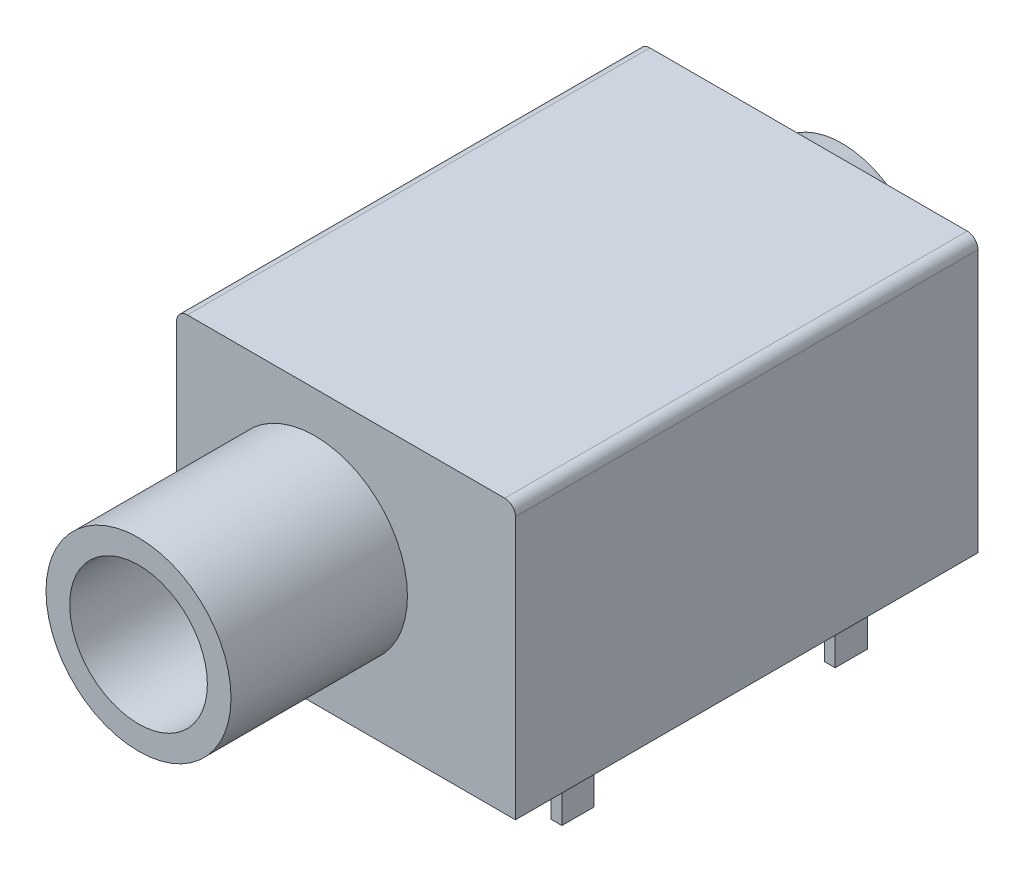
ISO-10303-21;
HEADER;
FILE_DESCRIPTION(('STEP AP214'),'2;1');
FILE_NAME('part.step','',(''),(''),'','','');
FILE_SCHEMA(('AUTOMOTIVE_DESIGN { 1 0 10303 214 1 1 1 1 }'));
ENDSEC;
DATA;
#1=APPLICATION_CONTEXT('core data for automotive mechanical design processes');
#2=APPLICATION_PROTOCOL_DEFINITION('international standard','automotive_design',2000,#1);
#3=PRODUCT_CONTEXT('',#1,'mechanical');
#4=PRODUCT('Part','Part','',(#3));
#5=PRODUCT_RELATED_PRODUCT_CATEGORY('part','',(#4));
#6=PRODUCT_DEFINITION_FORMATION('','',#4);
#7=PRODUCT_DEFINITION_CONTEXT('part definition',#1,'design');
#8=PRODUCT_DEFINITION('design','',#6,#7);
#9=PRODUCT_DEFINITION_SHAPE('','',#8);
#10=(LENGTH_UNIT() NAMED_UNIT(*) SI_UNIT(.MILLI.,.METRE.));
#11=(NAMED_UNIT(*) PLANE_ANGLE_UNIT() SI_UNIT($,.RADIAN.));
#12=(NAMED_UNIT(*) SI_UNIT($,.STERADIAN.) SOLID_ANGLE_UNIT());
#13=UNCERTAINTY_MEASURE_WITH_UNIT(LENGTH_MEASURE(1.E-05),#10,'distance_accuracy_value','');
#14=(GEOMETRIC_REPRESENTATION_CONTEXT(3) GLOBAL_UNCERTAINTY_ASSIGNED_CONTEXT((#13)) GLOBAL_UNIT_ASSIGNED_CONTEXT((#10,
#11,#12)) REPRESENTATION_CONTEXT('',''));
#15=CARTESIAN_POINT('',(0.,0.,0.));
#16=DIRECTION('',(0.,0.,1.));
#17=DIRECTION('',(1.,0.,0.));
#18=AXIS2_PLACEMENT_3D('',#15,#16,#17);
#19=CARTESIAN_POINT('',(0.,0.,-21.5));
#20=DIRECTION('',(0.,-1.,0.));
#21=DIRECTION('',(0.,0.,-1.));
#22=AXIS2_PLACEMENT_3D('',#19,#20,#21);
#23=PLANE('',#22);
#24=DIRECTION('',(1.,0.,0.));
#25=VECTOR('',#24,1.);
#26=CARTESIAN_POINT('',(0.,0.,0.));
#27=LINE('',#26,#25);
#28=CARTESIAN_POINT('',(0.,0.,0.));
#29=VERTEX_POINT('',#28);
#30=CARTESIAN_POINT('',(15.75,0.,0.));
#31=VERTEX_POINT('',#30);
#32=EDGE_CURVE('E393',#29,#31,#27,.T.);
#33=ORIENTED_EDGE('',*,*,#32,.F.);
#34=DIRECTION('',(0.,0.,1.));
#35=VECTOR('',#34,1.);
#36=CARTESIAN_POINT('',(0.,0.,-21.5));
#37=LINE('',#36,#35);
#38=CARTESIAN_POINT('',(0.,0.,-21.5));
#39=VERTEX_POINT('',#38);
#40=EDGE_CURVE('E41',#39,#29,#37,.T.);
#41=ORIENTED_EDGE('',*,*,#40,.F.);
#42=DIRECTION('',(1.,0.,0.));
#43=VECTOR('',#42,1.);
#44=CARTESIAN_POINT('',(0.,0.,-21.5));
#45=LINE('',#44,#43);
#46=CARTESIAN_POINT('',(15.75,0.,-21.5));
#47=VERTEX_POINT('',#46);
#48=EDGE_CURVE('E369',#39,#47,#45,.T.);
#49=ORIENTED_EDGE('',*,*,#48,.T.);
#50=DIRECTION('',(0.,0.,1.));
#51=VECTOR('',#50,1.);
#52=CARTESIAN_POINT('',(15.75,0.,-21.5));
#53=LINE('',#52,#51);
#54=EDGE_CURVE('E422',#47,#31,#53,.T.);
#55=ORIENTED_EDGE('',*,*,#54,.T.);
#56=EDGE_LOOP('',(#33,#41,#49,#55));
#57=FACE_BOUND('',#56,.T.);
#58=DIRECTION('',(-1.,0.,0.));
#59=VECTOR('',#58,1.);
#60=CARTESIAN_POINT('',(1.98,0.,-4.));
#61=LINE('',#60,#59);
#62=CARTESIAN_POINT('',(2.48,0.,-4.));
#63=VERTEX_POINT('',#62);
#64=CARTESIAN_POINT('',(1.98,0.,-4.));
#65=VERTEX_POINT('',#64);
#66=EDGE_CURVE('E322',#63,#65,#61,.T.);
#67=ORIENTED_EDGE('',*,*,#66,.F.);
#68=DIRECTION('',(0.,0.,1.));
#69=VECTOR('',#68,1.);
#70=CARTESIAN_POINT('',(2.48,0.,-4.));
#71=LINE('',#70,#69);
#72=CARTESIAN_POINT('',(2.48,0.,-5.5));
#73=VERTEX_POINT('',#72);
#74=EDGE_CURVE('E304',#73,#63,#71,.T.);
#75=ORIENTED_EDGE('',*,*,#74,.F.);
#76=DIRECTION('',(1.,0.,0.));
#77=VECTOR('',#76,1.);
#78=CARTESIAN_POINT('',(1.98,0.,-5.5));
#79=LINE('',#78,#77);
#80=CARTESIAN_POINT('',(1.98,0.,-5.5));
#81=VERTEX_POINT('',#80);
#82=EDGE_CURVE('E310',#81,#73,#79,.T.);
#83=ORIENTED_EDGE('',*,*,#82,.F.);
#84=DIRECTION('',(0.,0.,-1.));
#85=VECTOR('',#84,1.);
#86=CARTESIAN_POINT('',(1.98,0.,-4.));
#87=LINE('',#86,#85);
#88=EDGE_CURVE('E325',#65,#81,#87,.T.);
#89=ORIENTED_EDGE('',*,*,#88,.F.);
#90=EDGE_LOOP('',(#67,#75,#83,#89));
#91=FACE_BOUND('',#90,.T.);
#92=DIRECTION('',(-1.,0.,0.));
#93=VECTOR('',#92,1.);
#94=CARTESIAN_POINT('',(13.41,0.,-4.));
#95=LINE('',#94,#93);
#96=CARTESIAN_POINT('',(13.91,0.,-4.));
#97=VERTEX_POINT('',#96);
#98=CARTESIAN_POINT('',(13.41,0.,-4.));
#99=VERTEX_POINT('',#98);
#100=EDGE_CURVE('E282',#97,#99,#95,.T.);
#101=ORIENTED_EDGE('',*,*,#100,.F.);
#102=DIRECTION('',(0.,0.,1.));
#103=VECTOR('',#102,1.);
#104=CARTESIAN_POINT('',(13.91,0.,-5.5));
#105=LINE('',#104,#103);
#106=CARTESIAN_POINT('',(13.91,0.,-5.5));
#107=VERTEX_POINT('',#106);
#108=EDGE_CURVE('E264',#107,#97,#105,.T.);
#109=ORIENTED_EDGE('',*,*,#108,.F.);
#110=DIRECTION('',(1.,0.,0.));
#111=VECTOR('',#110,1.);
#112=CARTESIAN_POINT('',(13.41,0.,-5.5));
#113=LINE('',#112,#111);
#114=CARTESIAN_POINT('',(13.41,0.,-5.5));
#115=VERTEX_POINT('',#114);
#116=EDGE_CURVE('E270',#115,#107,#113,.T.);
#117=ORIENTED_EDGE('',*,*,#116,.F.);
#118=DIRECTION('',(0.,0.,-1.));
#119=VECTOR('',#118,1.);
#120=CARTESIAN_POINT('',(13.41,0.,-5.5));
#121=LINE('',#120,#119);
#122=EDGE_CURVE('E285',#99,#115,#121,.T.);
#123=ORIENTED_EDGE('',*,*,#122,.F.);
#124=EDGE_LOOP('',(#101,#109,#117,#123));
#125=FACE_BOUND('',#124,.T.);
#126=DIRECTION('',(-1.,0.,0.));
#127=VECTOR('',#126,1.);
#128=CARTESIAN_POINT('',(1.98,0.,-16.7));
#129=LINE('',#128,#127);
#130=CARTESIAN_POINT('',(2.48,0.,-16.7));
#131=VERTEX_POINT('',#130);
#132=CARTESIAN_POINT('',(1.98,0.,-16.7));
#133=VERTEX_POINT('',#132);
#134=EDGE_CURVE('E224',#131,#133,#129,.T.);
#135=ORIENTED_EDGE('',*,*,#134,.F.);
#136=DIRECTION('',(0.,0.,1.));
#137=VECTOR('',#136,1.);
#138=CARTESIAN_POINT('',(2.48,0.,-18.2));
#139=LINE('',#138,#137);
#140=CARTESIAN_POINT('',(2.48,0.,-18.2));
#141=VERTEX_POINT('',#140);
#142=EDGE_CURVE('E218',#141,#131,#139,.T.);
#143=ORIENTED_EDGE('',*,*,#142,.F.);
#144=DIRECTION('',(1.,0.,0.));
#145=VECTOR('',#144,1.);
#146=CARTESIAN_POINT('',(1.98,0.,-18.2));
#147=LINE('',#146,#145);
#148=CARTESIAN_POINT('',(1.98,0.,-18.2));
#149=VERTEX_POINT('',#148);
#150=EDGE_CURVE('E235',#149,#141,#147,.T.);
#151=ORIENTED_EDGE('',*,*,#150,.F.);
#152=DIRECTION('',(0.,0.,-1.));
#153=VECTOR('',#152,1.);
#154=CARTESIAN_POINT('',(1.98,0.,-18.2));
#155=LINE('',#154,#153);
#156=EDGE_CURVE('E247',#133,#149,#155,.T.);
#157=ORIENTED_EDGE('',*,*,#156,.F.);
#158=EDGE_LOOP('',(#135,#143,#151,#157));
#159=FACE_BOUND('',#158,.T.);
#160=DIRECTION('',(-1.,0.,0.));
#161=VECTOR('',#160,1.);
#162=CARTESIAN_POINT('',(13.41,0.,-16.7));
#163=LINE('',#162,#161);
#164=CARTESIAN_POINT('',(13.91,0.,-16.7));
#165=VERTEX_POINT('',#164);
#166=CARTESIAN_POINT('',(13.41,0.,-16.7));
#167=VERTEX_POINT('',#166);
#168=EDGE_CURVE('E813',#165,#167,#163,.T.);
#169=ORIENTED_EDGE('',*,*,#168,.F.);
#170=DIRECTION('',(0.,0.,1.));
#171=VECTOR('',#170,1.);
#172=CARTESIAN_POINT('',(13.91,0.,-18.2));
#173=LINE('',#172,#171);
#174=CARTESIAN_POINT('',(13.91,0.,-18.2));
#175=VERTEX_POINT('',#174);
#176=EDGE_CURVE('E215',#175,#165,#173,.T.);
#177=ORIENTED_EDGE('',*,*,#176,.F.);
#178=DIRECTION('',(1.,0.,0.));
#179=VECTOR('',#178,1.);
#180=CARTESIAN_POINT('',(13.41,0.,-18.2));
#181=LINE('',#180,#179);
#182=CARTESIAN_POINT('',(13.41,0.,-18.2));
#183=VERTEX_POINT('',#182);
#184=EDGE_CURVE('E211',#183,#175,#181,.T.);
#185=ORIENTED_EDGE('',*,*,#184,.F.);
#186=DIRECTION('',(0.,0.,-1.));
#187=VECTOR('',#186,1.);
#188=CARTESIAN_POINT('',(13.41,0.,-18.2));
#189=LINE('',#188,#187);
#190=EDGE_CURVE('E809',#167,#183,#189,.T.);
#191=ORIENTED_EDGE('',*,*,#190,.F.);
#192=EDGE_LOOP('',(#169,#177,#185,#191));
#193=FACE_BOUND('',#192,.T.);
#194=ADVANCED_FACE('F37',(#57,#91,#125,#159,#193),#23,.T.);
#195=CARTESIAN_POINT('',(0.,0.,-21.5));
#196=DIRECTION('',(-1.,0.,0.));
#197=DIRECTION('',(0.,0.,1.));
#198=AXIS2_PLACEMENT_3D('',#195,#196,#197);
#199=PLANE('',#198);
#200=DIRECTION('',(0.,-1.,0.));
#201=VECTOR('',#200,1.);
#202=CARTESIAN_POINT('',(0.,0.,0.));
#203=LINE('',#202,#201);
#204=CARTESIAN_POINT('',(0.,12.2,0.));
#205=VERTEX_POINT('',#204);
#206=EDGE_CURVE('E360',#205,#29,#203,.T.);
#207=ORIENTED_EDGE('',*,*,#206,.F.);
#208=DIRECTION('',(0.,0.,1.));
#209=VECTOR('',#208,1.);
#210=CARTESIAN_POINT('',(0.,12.2,-21.5));
#211=LINE('',#210,#209);
#212=CARTESIAN_POINT('',(0.,12.2,-21.5));
#213=VERTEX_POINT('',#212);
#214=EDGE_CURVE('E364',#213,#205,#211,.T.);
#215=ORIENTED_EDGE('',*,*,#214,.F.);
#216=DIRECTION('',(0.,-1.,0.));
#217=VECTOR('',#216,1.);
#218=CARTESIAN_POINT('',(0.,0.,-21.5));
#219=LINE('',#218,#217);
#220=EDGE_CURVE('E365',#213,#39,#219,.T.);
#221=ORIENTED_EDGE('',*,*,#220,.T.);
#222=ORIENTED_EDGE('',*,*,#40,.T.);
#223=EDGE_LOOP('',(#207,#215,#221,#222));
#224=FACE_BOUND('',#223,.T.);
#225=ADVANCED_FACE('F39',(#224),#199,.T.);
#226=CARTESIAN_POINT('',(0.5,12.2,-21.5));
#227=DIRECTION('',(0.,0.,1.));
#228=DIRECTION('',(1.,0.,0.));
#229=AXIS2_PLACEMENT_3D('',#226,#227,#228);
#230=CYLINDRICAL_SURFACE('',#229,0.5);
#231=CARTESIAN_POINT('',(0.5,12.2,0.));
#232=DIRECTION('',(0.,0.,1.));
#233=DIRECTION('',(-1.,0.,0.));
#234=AXIS2_PLACEMENT_3D('',#231,#232,#233);
#235=CIRCLE('',#234,0.5);
#236=CARTESIAN_POINT('',(0.500000000000004,12.7,0.));
#237=VERTEX_POINT('',#236);
#238=EDGE_CURVE('E370',#237,#205,#235,.T.);
#239=ORIENTED_EDGE('',*,*,#238,.F.);
#240=DIRECTION('',(0.,0.,1.));
#241=VECTOR('',#240,1.);
#242=CARTESIAN_POINT('',(0.500000000000004,12.7,-21.5));
#243=LINE('',#242,#241);
#244=CARTESIAN_POINT('',(0.500000000000004,12.7,-21.5));
#245=VERTEX_POINT('',#244);
#246=EDGE_CURVE('E414',#245,#237,#243,.T.);
#247=ORIENTED_EDGE('',*,*,#246,.F.);
#248=CARTESIAN_POINT('',(0.5,12.2,-21.5));
#249=DIRECTION('',(0.,0.,1.));
#250=DIRECTION('',(-1.,0.,0.));
#251=AXIS2_PLACEMENT_3D('',#248,#249,#250);
#252=CIRCLE('',#251,0.5);
#253=EDGE_CURVE('E386',#245,#213,#252,.T.);
#254=ORIENTED_EDGE('',*,*,#253,.T.);
#255=ORIENTED_EDGE('',*,*,#214,.T.);
#256=EDGE_LOOP('',(#239,#247,#254,#255));
#257=FACE_BOUND('',#256,.T.);
#258=ADVANCED_FACE('F439',(#257),#230,.T.);
#259=CARTESIAN_POINT('',(0.500000000000004,12.7,-21.5));
#260=DIRECTION('',(0.,1.,0.));
#261=DIRECTION('',(0.,0.,1.));
#262=AXIS2_PLACEMENT_3D('',#259,#260,#261);
#263=PLANE('',#262);
#264=DIRECTION('',(-1.,0.,0.));
#265=VECTOR('',#264,1.);
#266=CARTESIAN_POINT('',(0.500000000000004,12.7,0.));
#267=LINE('',#266,#265);
#268=CARTESIAN_POINT('',(15.25,12.7,0.));
#269=VERTEX_POINT('',#268);
#270=EDGE_CURVE('E405',#269,#237,#267,.T.);
#271=ORIENTED_EDGE('',*,*,#270,.F.);
#272=DIRECTION('',(0.,0.,1.));
#273=VECTOR('',#272,1.);
#274=CARTESIAN_POINT('',(15.25,12.7,-21.5));
#275=LINE('',#274,#273);
#276=CARTESIAN_POINT('',(15.25,12.7,-21.5));
#277=VERTEX_POINT('',#276);
#278=EDGE_CURVE('E417',#277,#269,#275,.T.);
#279=ORIENTED_EDGE('',*,*,#278,.F.);
#280=DIRECTION('',(-1.,0.,0.));
#281=VECTOR('',#280,1.);
#282=CARTESIAN_POINT('',(0.500000000000004,12.7,-21.5));
#283=LINE('',#282,#281);
#284=EDGE_CURVE('E382',#277,#245,#283,.T.);
#285=ORIENTED_EDGE('',*,*,#284,.T.);
#286=ORIENTED_EDGE('',*,*,#246,.T.);
#287=EDGE_LOOP('',(#271,#279,#285,#286));
#288=FACE_BOUND('',#287,.T.);
#289=ADVANCED_FACE('F452',(#288),#263,.T.);
#290=CARTESIAN_POINT('',(15.25,12.2,-21.5));
#291=DIRECTION('',(0.,0.,1.));
#292=DIRECTION('',(1.,0.,0.));
#293=AXIS2_PLACEMENT_3D('',#290,#291,#292);
#294=CYLINDRICAL_SURFACE('',#293,0.5);
#295=CARTESIAN_POINT('',(15.25,12.2,0.));
#296=DIRECTION('',(0.,0.,1.));
#297=DIRECTION('',(-1.,0.,0.));
#298=AXIS2_PLACEMENT_3D('',#295,#296,#297);
#299=CIRCLE('',#298,0.5);
#300=CARTESIAN_POINT('',(15.75,12.2,0.));
#301=VERTEX_POINT('',#300);
#302=EDGE_CURVE('E401',#301,#269,#299,.T.);
#303=ORIENTED_EDGE('',*,*,#302,.F.);
#304=DIRECTION('',(0.,0.,1.));
#305=VECTOR('',#304,1.);
#306=CARTESIAN_POINT('',(15.75,12.2,-21.5));
#307=LINE('',#306,#305);
#308=CARTESIAN_POINT('',(15.75,12.2,-21.5));
#309=VERTEX_POINT('',#308);
#310=EDGE_CURVE('E420',#309,#301,#307,.T.);
#311=ORIENTED_EDGE('',*,*,#310,.F.);
#312=CARTESIAN_POINT('',(15.25,12.2,-21.5));
#313=DIRECTION('',(0.,0.,1.));
#314=DIRECTION('',(-1.,0.,0.));
#315=AXIS2_PLACEMENT_3D('',#312,#313,#314);
#316=CIRCLE('',#315,0.5);
#317=EDGE_CURVE('E378',#309,#277,#316,.T.);
#318=ORIENTED_EDGE('',*,*,#317,.T.);
#319=ORIENTED_EDGE('',*,*,#278,.T.);
#320=EDGE_LOOP('',(#303,#311,#318,#319));
#321=FACE_BOUND('',#320,.T.);
#322=ADVANCED_FACE('F450',(#321),#294,.T.);
#323=CARTESIAN_POINT('',(15.75,0.,-21.5));
#324=DIRECTION('',(1.,0.,0.));
#325=DIRECTION('',(0.,0.,-1.));
#326=AXIS2_PLACEMENT_3D('',#323,#324,#325);
#327=PLANE('',#326);
#328=DIRECTION('',(0.,1.,0.));
#329=VECTOR('',#328,1.);
#330=CARTESIAN_POINT('',(15.75,0.,0.));
#331=LINE('',#330,#329);
#332=EDGE_CURVE('E397',#31,#301,#331,.T.);
#333=ORIENTED_EDGE('',*,*,#332,.F.);
#334=ORIENTED_EDGE('',*,*,#54,.F.);
#335=DIRECTION('',(0.,1.,0.));
#336=VECTOR('',#335,1.);
#337=CARTESIAN_POINT('',(15.75,0.,-21.5));
#338=LINE('',#337,#336);
#339=EDGE_CURVE('E374',#47,#309,#338,.T.);
#340=ORIENTED_EDGE('',*,*,#339,.T.);
#341=ORIENTED_EDGE('',*,*,#310,.T.);
#342=EDGE_LOOP('',(#333,#334,#340,#341));
#343=FACE_BOUND('',#342,.T.);
#344=ADVANCED_FACE('F447',(#343),#327,.T.);
#345=CARTESIAN_POINT('',(0.5,12.2,-21.5));
#346=DIRECTION('',(0.,0.,-1.));
#347=DIRECTION('',(-1.,0.,0.));
#348=AXIS2_PLACEMENT_3D('',#345,#346,#347);
#349=PLANE('',#348);
#350=CARTESIAN_POINT('',(6.43,6.5,-21.5));
#351=DIRECTION('',(0.,0.,-1.));
#352=DIRECTION('',(-1.,0.,0.));
#353=AXIS2_PLACEMENT_3D('',#350,#351,#352);
#354=CIRCLE('',#353,4.3);
#355=CARTESIAN_POINT('',(2.13,6.5,-21.5));
#356=VERTEX_POINT('',#355);
#357=EDGE_CURVE('E11',#356,#356,#354,.T.);
#358=ORIENTED_EDGE('',*,*,#357,.F.);
#359=EDGE_LOOP('',(#358));
#360=FACE_BOUND('',#359,.T.);
#361=ORIENTED_EDGE('',*,*,#220,.F.);
#362=ORIENTED_EDGE('',*,*,#253,.F.);
#363=ORIENTED_EDGE('',*,*,#284,.F.);
#364=ORIENTED_EDGE('',*,*,#317,.F.);
#365=ORIENTED_EDGE('',*,*,#339,.F.);
#366=ORIENTED_EDGE('',*,*,#48,.F.);
#367=EDGE_LOOP('',(#361,#362,#363,#364,#365,#366));
#368=FACE_BOUND('',#367,.T.);
#369=ADVANCED_FACE('F442',(#360,#368),#349,.T.);
#370=CARTESIAN_POINT('',(0.5,12.2,0.));
#371=DIRECTION('',(0.,0.,-1.));
#372=DIRECTION('',(-1.,0.,0.));
#373=AXIS2_PLACEMENT_3D('',#370,#371,#372);
#374=PLANE('',#373);
#375=CARTESIAN_POINT('',(6.43,6.5,0.));
#376=DIRECTION('',(0.,0.,1.));
#377=DIRECTION('',(1.,0.,0.));
#378=AXIS2_PLACEMENT_3D('',#375,#376,#377);
#379=CIRCLE('',#378,4.3);
#380=CARTESIAN_POINT('',(10.73,6.5,0.));
#381=VERTEX_POINT('',#380);
#382=EDGE_CURVE('E47',#381,#381,#379,.T.);
#383=ORIENTED_EDGE('',*,*,#382,.F.);
#384=EDGE_LOOP('',(#383));
#385=FACE_BOUND('',#384,.T.);
#386=ORIENTED_EDGE('',*,*,#206,.T.);
#387=ORIENTED_EDGE('',*,*,#32,.T.);
#388=ORIENTED_EDGE('',*,*,#332,.T.);
#389=ORIENTED_EDGE('',*,*,#302,.T.);
#390=ORIENTED_EDGE('',*,*,#270,.T.);
#391=ORIENTED_EDGE('',*,*,#238,.T.);
#392=EDGE_LOOP('',(#386,#387,#388,#389,#390,#391));
#393=FACE_BOUND('',#392,.T.);
#394=ADVANCED_FACE('F435',(#385,#393),#374,.F.);
#395=CARTESIAN_POINT('',(6.43,6.5,8.2));
#396=DIRECTION('',(0.,0.,-1.));
#397=DIRECTION('',(-1.,0.,0.));
#398=AXIS2_PLACEMENT_3D('',#395,#396,#397);
#399=CYLINDRICAL_SURFACE('',#398,4.3);
#400=CARTESIAN_POINT('',(6.43,6.5,8.2));
#401=DIRECTION('',(0.,0.,1.));
#402=DIRECTION('',(1.,0.,0.));
#403=AXIS2_PLACEMENT_3D('',#400,#401,#402);
#404=CIRCLE('',#403,4.3);
#405=CARTESIAN_POINT('',(10.73,6.5,8.2));
#406=VERTEX_POINT('',#405);
#407=EDGE_CURVE('E356',#406,#406,#404,.T.);
#408=ORIENTED_EDGE('',*,*,#407,.F.);
#409=EDGE_LOOP('',(#408));
#410=FACE_BOUND('',#409,.T.);
#411=ORIENTED_EDGE('',*,*,#382,.T.);
#412=EDGE_LOOP('',(#411));
#413=FACE_BOUND('',#412,.T.);
#414=ADVANCED_FACE('F475',(#410,#413),#399,.T.);
#415=CARTESIAN_POINT('',(6.43,6.5,8.2));
#416=DIRECTION('',(0.,0.,1.));
#417=DIRECTION('',(1.,0.,0.));
#418=AXIS2_PLACEMENT_3D('',#415,#416,#417);
#419=PLANE('',#418);
#420=CARTESIAN_POINT('',(6.43,6.5,8.2));
#421=DIRECTION('',(0.,0.,1.));
#422=DIRECTION('',(1.,0.,0.));
#423=AXIS2_PLACEMENT_3D('',#420,#421,#422);
#424=CIRCLE('',#423,3.2);
#425=CARTESIAN_POINT('',(9.63,6.5,8.2));
#426=VERTEX_POINT('',#425);
#427=EDGE_CURVE('E344',#426,#426,#424,.T.);
#428=ORIENTED_EDGE('',*,*,#427,.F.);
#429=EDGE_LOOP('',(#428));
#430=FACE_BOUND('',#429,.T.);
#431=ORIENTED_EDGE('',*,*,#407,.T.);
#432=EDGE_LOOP('',(#431));
#433=FACE_BOUND('',#432,.T.);
#434=ADVANCED_FACE('F482',(#430,#433),#419,.T.);
#435=CARTESIAN_POINT('',(6.43,6.5,-21.5));
#436=DIRECTION('',(0.,0.,1.));
#437=DIRECTION('',(-1.,0.,0.));
#438=AXIS2_PLACEMENT_3D('',#435,#436,#437);
#439=CONICAL_SURFACE('',#438,4.3,0.15707963267949);
#440=CARTESIAN_POINT('',(6.43,6.5,-24.5));
#441=DIRECTION('',(0.,0.,-1.));
#442=DIRECTION('',(-1.,0.,0.));
#443=AXIS2_PLACEMENT_3D('',#440,#441,#442);
#444=CIRCLE('',#443,3.82484667902639);
#445=CARTESIAN_POINT('',(2.60515332097361,6.5,-24.5));
#446=VERTEX_POINT('',#445);
#447=EDGE_CURVE('E349',#446,#446,#444,.T.);
#448=ORIENTED_EDGE('',*,*,#447,.F.);
#449=EDGE_LOOP('',(#448));
#450=FACE_BOUND('',#449,.T.);
#451=ORIENTED_EDGE('',*,*,#357,.T.);
#452=EDGE_LOOP('',(#451));
#453=FACE_BOUND('',#452,.T.);
#454=ADVANCED_FACE('F486',(#450,#453),#439,.T.);
#455=CARTESIAN_POINT('',(6.43,6.5,-24.5));
#456=DIRECTION('',(0.,0.,-1.));
#457=DIRECTION('',(-1.,0.,0.));
#458=AXIS2_PLACEMENT_3D('',#455,#456,#457);
#459=PLANE('',#458);
#460=ORIENTED_EDGE('',*,*,#447,.T.);
#461=EDGE_LOOP('',(#460));
#462=FACE_BOUND('',#461,.T.);
#463=ADVANCED_FACE('F490',(#462),#459,.T.);
#464=CARTESIAN_POINT('',(6.43,6.5,-22.8));
#465=DIRECTION('',(0.,0.,1.));
#466=DIRECTION('',(1.,0.,0.));
#467=AXIS2_PLACEMENT_3D('',#464,#465,#466);
#468=CYLINDRICAL_SURFACE('',#467,3.2);
#469=CARTESIAN_POINT('',(6.43,6.5,-22.8));
#470=DIRECTION('',(0.,0.,1.));
#471=DIRECTION('',(1.,0.,0.));
#472=AXIS2_PLACEMENT_3D('',#469,#470,#471);
#473=CIRCLE('',#472,3.2);
#474=CARTESIAN_POINT('',(9.63,6.5,-22.8));
#475=VERTEX_POINT('',#474);
#476=EDGE_CURVE('E345',#475,#475,#473,.T.);
#477=ORIENTED_EDGE('',*,*,#476,.F.);
#478=EDGE_LOOP('',(#477));
#479=FACE_BOUND('',#478,.T.);
#480=ORIENTED_EDGE('',*,*,#427,.T.);
#481=EDGE_LOOP('',(#480));
#482=FACE_BOUND('',#481,.T.);
#483=ADVANCED_FACE('F494',(#479,#482),#468,.F.);
#484=CARTESIAN_POINT('',(6.43,6.5,-22.8));
#485=DIRECTION('',(0.,0.,1.));
#486=DIRECTION('',(1.,0.,0.));
#487=AXIS2_PLACEMENT_3D('',#484,#485,#486);
#488=PLANE('',#487);
#489=ORIENTED_EDGE('',*,*,#476,.T.);
#490=EDGE_LOOP('',(#489));
#491=FACE_BOUND('',#490,.T.);
#492=ADVANCED_FACE('F498',(#491),#488,.T.);
#493=CARTESIAN_POINT('',(2.48,-3.15,-4.));
#494=DIRECTION('',(-1.,0.,0.));
#495=DIRECTION('',(0.,0.,1.));
#496=AXIS2_PLACEMENT_3D('',#493,#494,#495);
#497=PLANE('',#496);
#498=ORIENTED_EDGE('',*,*,#74,.T.);
#499=DIRECTION('',(0.,1.,0.));
#500=VECTOR('',#499,1.);
#501=CARTESIAN_POINT('',(2.48,-3.15,-4.));
#502=LINE('',#501,#500);
#503=CARTESIAN_POINT('',(2.48,-3.15,-4.));
#504=VERTEX_POINT('',#503);
#505=EDGE_CURVE('E341',#504,#63,#502,.T.);
#506=ORIENTED_EDGE('',*,*,#505,.F.);
#507=DIRECTION('',(0.,0.,1.));
#508=VECTOR('',#507,1.);
#509=CARTESIAN_POINT('',(2.48,-3.15,-4.));
#510=LINE('',#509,#508);
#511=CARTESIAN_POINT('',(2.48,-3.15,-5.5));
#512=VERTEX_POINT('',#511);
#513=EDGE_CURVE('E305',#512,#504,#510,.T.);
#514=ORIENTED_EDGE('',*,*,#513,.F.);
#515=DIRECTION('',(0.,1.,0.));
#516=VECTOR('',#515,1.);
#517=CARTESIAN_POINT('',(2.48,-3.15,-5.5));
#518=LINE('',#517,#516);
#519=EDGE_CURVE('E319',#512,#73,#518,.T.);
#520=ORIENTED_EDGE('',*,*,#519,.T.);
#521=EDGE_LOOP('',(#498,#506,#514,#520));
#522=FACE_BOUND('',#521,.T.);
#523=ADVANCED_FACE('F502',(#522),#497,.F.);
#524=CARTESIAN_POINT('',(1.98,-3.15,-4.));
#525=DIRECTION('',(0.,0.,-1.));
#526=DIRECTION('',(-1.,0.,0.));
#527=AXIS2_PLACEMENT_3D('',#524,#525,#526);
#528=PLANE('',#527);
#529=ORIENTED_EDGE('',*,*,#66,.T.);
#530=DIRECTION('',(0.,1.,0.));
#531=VECTOR('',#530,1.);
#532=CARTESIAN_POINT('',(1.98,-3.15,-4.));
#533=LINE('',#532,#531);
#534=CARTESIAN_POINT('',(1.98,-3.15,-4.));
#535=VERTEX_POINT('',#534);
#536=EDGE_CURVE('E337',#535,#65,#533,.T.);
#537=ORIENTED_EDGE('',*,*,#536,.F.);
#538=DIRECTION('',(-1.,0.,0.));
#539=VECTOR('',#538,1.);
#540=CARTESIAN_POINT('',(1.98,-3.15,-4.));
#541=LINE('',#540,#539);
#542=EDGE_CURVE('E309',#504,#535,#541,.T.);
#543=ORIENTED_EDGE('',*,*,#542,.F.);
#544=ORIENTED_EDGE('',*,*,#505,.T.);
#545=EDGE_LOOP('',(#529,#537,#543,#544));
#546=FACE_BOUND('',#545,.T.);
#547=ADVANCED_FACE('F506',(#546),#528,.F.);
#548=CARTESIAN_POINT('',(1.98,-3.15,-4.));
#549=DIRECTION('',(1.,0.,0.));
#550=DIRECTION('',(0.,0.,-1.));
#551=AXIS2_PLACEMENT_3D('',#548,#549,#550);
#552=PLANE('',#551);
#553=ORIENTED_EDGE('',*,*,#88,.T.);
#554=DIRECTION('',(0.,1.,0.));
#555=VECTOR('',#554,1.);
#556=CARTESIAN_POINT('',(1.98,-3.15,-5.5));
#557=LINE('',#556,#555);
#558=CARTESIAN_POINT('',(1.98,-3.15,-5.5));
#559=VERTEX_POINT('',#558);
#560=EDGE_CURVE('E334',#559,#81,#557,.T.);
#561=ORIENTED_EDGE('',*,*,#560,.F.);
#562=DIRECTION('',(0.,0.,-1.));
#563=VECTOR('',#562,1.);
#564=CARTESIAN_POINT('',(1.98,-3.15,-4.));
#565=LINE('',#564,#563);
#566=EDGE_CURVE('E313',#535,#559,#565,.T.);
#567=ORIENTED_EDGE('',*,*,#566,.F.);
#568=ORIENTED_EDGE('',*,*,#536,.T.);
#569=EDGE_LOOP('',(#553,#561,#567,#568));
#570=FACE_BOUND('',#569,.T.);
#571=ADVANCED_FACE('F510',(#570),#552,.F.);
#572=CARTESIAN_POINT('',(1.98,-3.15,-5.5));
#573=DIRECTION('',(0.,0.,1.));
#574=DIRECTION('',(1.,0.,0.));
#575=AXIS2_PLACEMENT_3D('',#572,#573,#574);
#576=PLANE('',#575);
#577=ORIENTED_EDGE('',*,*,#82,.T.);
#578=ORIENTED_EDGE('',*,*,#519,.F.);
#579=DIRECTION('',(1.,0.,0.));
#580=VECTOR('',#579,1.);
#581=CARTESIAN_POINT('',(1.98,-3.15,-5.5));
#582=LINE('',#581,#580);
#583=EDGE_CURVE('E316',#559,#512,#582,.T.);
#584=ORIENTED_EDGE('',*,*,#583,.F.);
#585=ORIENTED_EDGE('',*,*,#560,.T.);
#586=EDGE_LOOP('',(#577,#578,#584,#585));
#587=FACE_BOUND('',#586,.T.);
#588=ADVANCED_FACE('F514',(#587),#576,.F.);
#589=CARTESIAN_POINT('',(0.,-3.15,0.));
#590=DIRECTION('',(0.,-1.,0.));
#591=DIRECTION('',(0.,0.,-1.));
#592=AXIS2_PLACEMENT_3D('',#589,#590,#591);
#593=PLANE('',#592);
#594=ORIENTED_EDGE('',*,*,#513,.T.);
#595=ORIENTED_EDGE('',*,*,#542,.T.);
#596=ORIENTED_EDGE('',*,*,#566,.T.);
#597=ORIENTED_EDGE('',*,*,#583,.T.);
#598=EDGE_LOOP('',(#594,#595,#596,#597));
#599=FACE_BOUND('',#598,.T.);
#600=ADVANCED_FACE('F518',(#599),#593,.T.);
#601=CARTESIAN_POINT('',(13.91,-3.15,-5.5));
#602=DIRECTION('',(-1.,0.,0.));
#603=DIRECTION('',(0.,0.,1.));
#604=AXIS2_PLACEMENT_3D('',#601,#602,#603);
#605=PLANE('',#604);
#606=ORIENTED_EDGE('',*,*,#108,.T.);
#607=DIRECTION('',(0.,1.,0.));
#608=VECTOR('',#607,1.);
#609=CARTESIAN_POINT('',(13.91,-3.15,-4.));
#610=LINE('',#609,#608);
#611=CARTESIAN_POINT('',(13.91,-3.15,-4.));
#612=VERTEX_POINT('',#611);
#613=EDGE_CURVE('E301',#612,#97,#610,.T.);
#614=ORIENTED_EDGE('',*,*,#613,.F.);
#615=DIRECTION('',(0.,0.,1.));
#616=VECTOR('',#615,1.);
#617=CARTESIAN_POINT('',(13.91,-3.15,-5.5));
#618=LINE('',#617,#616);
#619=CARTESIAN_POINT('',(13.91,-3.15,-5.5));
#620=VERTEX_POINT('',#619);
#621=EDGE_CURVE('E265',#620,#612,#618,.T.);
#622=ORIENTED_EDGE('',*,*,#621,.F.);
#623=DIRECTION('',(0.,1.,0.));
#624=VECTOR('',#623,1.);
#625=CARTESIAN_POINT('',(13.91,-3.15,-5.5));
#626=LINE('',#625,#624);
#627=EDGE_CURVE('E278',#620,#107,#626,.T.);
#628=ORIENTED_EDGE('',*,*,#627,.T.);
#629=EDGE_LOOP('',(#606,#614,#622,#628));
#630=FACE_BOUND('',#629,.T.);
#631=ADVANCED_FACE('F522',(#630),#605,.F.);
#632=CARTESIAN_POINT('',(13.41,-3.15,-4.));
#633=DIRECTION('',(0.,0.,-1.));
#634=DIRECTION('',(-1.,0.,0.));
#635=AXIS2_PLACEMENT_3D('',#632,#633,#634);
#636=PLANE('',#635);
#637=ORIENTED_EDGE('',*,*,#100,.T.);
#638=DIRECTION('',(0.,1.,0.));
#639=VECTOR('',#638,1.);
#640=CARTESIAN_POINT('',(13.41,-3.15,-4.));
#641=LINE('',#640,#639);
#642=CARTESIAN_POINT('',(13.41,-3.15,-4.));
#643=VERTEX_POINT('',#642);
#644=EDGE_CURVE('E297',#643,#99,#641,.T.);
#645=ORIENTED_EDGE('',*,*,#644,.F.);
#646=DIRECTION('',(-1.,0.,0.));
#647=VECTOR('',#646,1.);
#648=CARTESIAN_POINT('',(13.41,-3.15,-4.));
#649=LINE('',#648,#647);
#650=EDGE_CURVE('E269',#612,#643,#649,.T.);
#651=ORIENTED_EDGE('',*,*,#650,.F.);
#652=ORIENTED_EDGE('',*,*,#613,.T.);
#653=EDGE_LOOP('',(#637,#645,#651,#652));
#654=FACE_BOUND('',#653,.T.);
#655=ADVANCED_FACE('F526',(#654),#636,.F.);
#656=CARTESIAN_POINT('',(13.41,-3.15,-5.5));
#657=DIRECTION('',(1.,0.,0.));
#658=DIRECTION('',(0.,0.,-1.));
#659=AXIS2_PLACEMENT_3D('',#656,#657,#658);
#660=PLANE('',#659);
#661=ORIENTED_EDGE('',*,*,#122,.T.);
#662=DIRECTION('',(0.,1.,0.));
#663=VECTOR('',#662,1.);
#664=CARTESIAN_POINT('',(13.41,-3.15,-5.5));
#665=LINE('',#664,#663);
#666=CARTESIAN_POINT('',(13.41,-3.15,-5.5));
#667=VERTEX_POINT('',#666);
#668=EDGE_CURVE('E294',#667,#115,#665,.T.);
#669=ORIENTED_EDGE('',*,*,#668,.F.);
#670=DIRECTION('',(0.,0.,-1.));
#671=VECTOR('',#670,1.);
#672=CARTESIAN_POINT('',(13.41,-3.15,-5.5));
#673=LINE('',#672,#671);
#674=EDGE_CURVE('E272',#643,#667,#673,.T.);
#675=ORIENTED_EDGE('',*,*,#674,.F.);
#676=ORIENTED_EDGE('',*,*,#644,.T.);
#677=EDGE_LOOP('',(#661,#669,#675,#676));
#678=FACE_BOUND('',#677,.T.);
#679=ADVANCED_FACE('F530',(#678),#660,.F.);
#680=CARTESIAN_POINT('',(13.41,-3.15,-5.5));
#681=DIRECTION('',(0.,0.,1.));
#682=DIRECTION('',(1.,0.,0.));
#683=AXIS2_PLACEMENT_3D('',#680,#681,#682);
#684=PLANE('',#683);
#685=ORIENTED_EDGE('',*,*,#116,.T.);
#686=ORIENTED_EDGE('',*,*,#627,.F.);
#687=DIRECTION('',(1.,0.,0.));
#688=VECTOR('',#687,1.);
#689=CARTESIAN_POINT('',(13.41,-3.15,-5.5));
#690=LINE('',#689,#688);
#691=EDGE_CURVE('E275',#667,#620,#690,.T.);
#692=ORIENTED_EDGE('',*,*,#691,.F.);
#693=ORIENTED_EDGE('',*,*,#668,.T.);
#694=EDGE_LOOP('',(#685,#686,#692,#693));
#695=FACE_BOUND('',#694,.T.);
#696=ADVANCED_FACE('F534',(#695),#684,.F.);
#697=CARTESIAN_POINT('',(0.,-3.15,0.));
#698=DIRECTION('',(0.,1.,0.));
#699=DIRECTION('',(0.,0.,1.));
#700=AXIS2_PLACEMENT_3D('',#697,#698,#699);
#701=PLANE('',#700);
#702=ORIENTED_EDGE('',*,*,#621,.T.);
#703=ORIENTED_EDGE('',*,*,#650,.T.);
#704=ORIENTED_EDGE('',*,*,#674,.T.);
#705=ORIENTED_EDGE('',*,*,#691,.T.);
#706=EDGE_LOOP('',(#702,#703,#704,#705));
#707=FACE_BOUND('',#706,.T.);
#708=ADVANCED_FACE('F538',(#707),#701,.F.);
#709=CARTESIAN_POINT('',(2.48,-3.15,-18.2));
#710=DIRECTION('',(-1.,0.,0.));
#711=DIRECTION('',(0.,0.,1.));
#712=AXIS2_PLACEMENT_3D('',#709,#710,#711);
#713=PLANE('',#712);
#714=ORIENTED_EDGE('',*,*,#142,.T.);
#715=DIRECTION('',(0.,1.,0.));
#716=VECTOR('',#715,1.);
#717=CARTESIAN_POINT('',(2.48,-3.15,-16.7));
#718=LINE('',#717,#716);
#719=CARTESIAN_POINT('',(2.48,-3.15,-16.7));
#720=VERTEX_POINT('',#719);
#721=EDGE_CURVE('E261',#720,#131,#718,.T.);
#722=ORIENTED_EDGE('',*,*,#721,.F.);
#723=DIRECTION('',(0.,0.,1.));
#724=VECTOR('',#723,1.);
#725=CARTESIAN_POINT('',(2.48,-3.15,-18.2));
#726=LINE('',#725,#724);
#727=CARTESIAN_POINT('',(2.48,-3.15,-18.2));
#728=VERTEX_POINT('',#727);
#729=EDGE_CURVE('E230',#728,#720,#726,.T.);
#730=ORIENTED_EDGE('',*,*,#729,.F.);
#731=DIRECTION('',(0.,1.,0.));
#732=VECTOR('',#731,1.);
#733=CARTESIAN_POINT('',(2.48,-3.15,-18.2));
#734=LINE('',#733,#732);
#735=EDGE_CURVE('E243',#728,#141,#734,.T.);
#736=ORIENTED_EDGE('',*,*,#735,.T.);
#737=EDGE_LOOP('',(#714,#722,#730,#736));
#738=FACE_BOUND('',#737,.T.);
#739=ADVANCED_FACE('F542',(#738),#713,.F.);
#740=CARTESIAN_POINT('',(1.98,-3.15,-16.7));
#741=DIRECTION('',(0.,0.,-1.));
#742=DIRECTION('',(-1.,0.,0.));
#743=AXIS2_PLACEMENT_3D('',#740,#741,#742);
#744=PLANE('',#743);
#745=ORIENTED_EDGE('',*,*,#134,.T.);
#746=DIRECTION('',(0.,1.,0.));
#747=VECTOR('',#746,1.);
#748=CARTESIAN_POINT('',(1.98,-3.15,-16.7));
#749=LINE('',#748,#747);
#750=CARTESIAN_POINT('',(1.98,-3.15,-16.7));
#751=VERTEX_POINT('',#750);
#752=EDGE_CURVE('E257',#751,#133,#749,.T.);
#753=ORIENTED_EDGE('',*,*,#752,.F.);
#754=DIRECTION('',(-1.,0.,0.));
#755=VECTOR('',#754,1.);
#756=CARTESIAN_POINT('',(1.98,-3.15,-16.7));
#757=LINE('',#756,#755);
#758=EDGE_CURVE('E234',#720,#751,#757,.T.);
#759=ORIENTED_EDGE('',*,*,#758,.F.);
#760=ORIENTED_EDGE('',*,*,#721,.T.);
#761=EDGE_LOOP('',(#745,#753,#759,#760));
#762=FACE_BOUND('',#761,.T.);
#763=ADVANCED_FACE('F546',(#762),#744,.F.);
#764=CARTESIAN_POINT('',(1.98,-3.15,-18.2));
#765=DIRECTION('',(1.,0.,0.));
#766=DIRECTION('',(0.,0.,-1.));
#767=AXIS2_PLACEMENT_3D('',#764,#765,#766);
#768=PLANE('',#767);
#769=ORIENTED_EDGE('',*,*,#156,.T.);
#770=DIRECTION('',(0.,1.,0.));
#771=VECTOR('',#770,1.);
#772=CARTESIAN_POINT('',(1.98,-3.15,-18.2));
#773=LINE('',#772,#771);
#774=CARTESIAN_POINT('',(1.98,-3.15,-18.2));
#775=VERTEX_POINT('',#774);
#776=EDGE_CURVE('E63',#775,#149,#773,.T.);
#777=ORIENTED_EDGE('',*,*,#776,.F.);
#778=DIRECTION('',(0.,0.,-1.));
#779=VECTOR('',#778,1.);
#780=CARTESIAN_POINT('',(1.98,-3.15,-18.2));
#781=LINE('',#780,#779);
#782=EDGE_CURVE('E238',#751,#775,#781,.T.);
#783=ORIENTED_EDGE('',*,*,#782,.F.);
#784=ORIENTED_EDGE('',*,*,#752,.T.);
#785=EDGE_LOOP('',(#769,#777,#783,#784));
#786=FACE_BOUND('',#785,.T.);
#787=ADVANCED_FACE('F550',(#786),#768,.F.);
#788=CARTESIAN_POINT('',(1.98,-3.15,-18.2));
#789=DIRECTION('',(0.,0.,1.));
#790=DIRECTION('',(1.,0.,0.));
#791=AXIS2_PLACEMENT_3D('',#788,#789,#790);
#792=PLANE('',#791);
#793=ORIENTED_EDGE('',*,*,#150,.T.);
#794=ORIENTED_EDGE('',*,*,#735,.F.);
#795=DIRECTION('',(1.,0.,0.));
#796=VECTOR('',#795,1.);
#797=CARTESIAN_POINT('',(1.98,-3.15,-18.2));
#798=LINE('',#797,#796);
#799=EDGE_CURVE('E241',#775,#728,#798,.T.);
#800=ORIENTED_EDGE('',*,*,#799,.F.);
#801=ORIENTED_EDGE('',*,*,#776,.T.);
#802=EDGE_LOOP('',(#793,#794,#800,#801));
#803=FACE_BOUND('',#802,.T.);
#804=ADVANCED_FACE('F554',(#803),#792,.F.);
#805=CARTESIAN_POINT('',(0.,-3.15,0.));
#806=DIRECTION('',(0.,1.,0.));
#807=DIRECTION('',(0.,0.,1.));
#808=AXIS2_PLACEMENT_3D('',#805,#806,#807);
#809=PLANE('',#808);
#810=ORIENTED_EDGE('',*,*,#729,.T.);
#811=ORIENTED_EDGE('',*,*,#758,.T.);
#812=ORIENTED_EDGE('',*,*,#782,.T.);
#813=ORIENTED_EDGE('',*,*,#799,.T.);
#814=EDGE_LOOP('',(#810,#811,#812,#813));
#815=FACE_BOUND('',#814,.T.);
#816=ADVANCED_FACE('F558',(#815),#809,.F.);
#817=CARTESIAN_POINT('',(13.91,-3.15,-18.2));
#818=DIRECTION('',(-1.,0.,0.));
#819=DIRECTION('',(0.,0.,1.));
#820=AXIS2_PLACEMENT_3D('',#817,#818,#819);
#821=PLANE('',#820);
#822=ORIENTED_EDGE('',*,*,#176,.T.);
#823=DIRECTION('',(0.,1.,0.));
#824=VECTOR('',#823,1.);
#825=CARTESIAN_POINT('',(13.91,-3.15,-16.7));
#826=LINE('',#825,#824);
#827=CARTESIAN_POINT('',(13.91,-3.15,-16.7));
#828=VERTEX_POINT('',#827);
#829=EDGE_CURVE('E194',#828,#165,#826,.T.);
#830=ORIENTED_EDGE('',*,*,#829,.F.);
#831=DIRECTION('',(0.,0.,1.));
#832=VECTOR('',#831,1.);
#833=CARTESIAN_POINT('',(13.91,-3.15,-18.2));
#834=LINE('',#833,#832);
#835=CARTESIAN_POINT('',(13.91,-3.15,-18.2));
#836=VERTEX_POINT('',#835);
#837=EDGE_CURVE('E202',#836,#828,#834,.T.);
#838=ORIENTED_EDGE('',*,*,#837,.F.);
#839=DIRECTION('',(0.,1.,0.));
#840=VECTOR('',#839,1.);
#841=CARTESIAN_POINT('',(13.91,-3.15,-18.2));
#842=LINE('',#841,#840);
#843=EDGE_CURVE('E805',#836,#175,#842,.T.);
#844=ORIENTED_EDGE('',*,*,#843,.T.);
#845=EDGE_LOOP('',(#822,#830,#838,#844));
#846=FACE_BOUND('',#845,.T.);
#847=ADVANCED_FACE('F213',(#846),#821,.F.);
#848=CARTESIAN_POINT('',(13.41,-3.15,-16.7));
#849=DIRECTION('',(0.,0.,-1.));
#850=DIRECTION('',(-1.,0.,0.));
#851=AXIS2_PLACEMENT_3D('',#848,#849,#850);
#852=PLANE('',#851);
#853=ORIENTED_EDGE('',*,*,#168,.T.);
#854=DIRECTION('',(0.,1.,0.));
#855=VECTOR('',#854,1.);
#856=CARTESIAN_POINT('',(13.41,-3.15,-16.7));
#857=LINE('',#856,#855);
#858=CARTESIAN_POINT('',(13.41,-3.15,-16.7));
#859=VERTEX_POINT('',#858);
#860=EDGE_CURVE('E197',#859,#167,#857,.T.);
#861=ORIENTED_EDGE('',*,*,#860,.F.);
#862=DIRECTION('',(-1.,0.,0.));
#863=VECTOR('',#862,1.);
#864=CARTESIAN_POINT('',(13.41,-3.15,-16.7));
#865=LINE('',#864,#863);
#866=EDGE_CURVE('E190',#828,#859,#865,.T.);
#867=ORIENTED_EDGE('',*,*,#866,.F.);
#868=ORIENTED_EDGE('',*,*,#829,.T.);
#869=EDGE_LOOP('',(#853,#861,#867,#868));
#870=FACE_BOUND('',#869,.T.);
#871=ADVANCED_FACE('F192',(#870),#852,.F.);
#872=CARTESIAN_POINT('',(13.41,-3.15,-18.2));
#873=DIRECTION('',(1.,0.,0.));
#874=DIRECTION('',(0.,0.,-1.));
#875=AXIS2_PLACEMENT_3D('',#872,#873,#874);
#876=PLANE('',#875);
#877=ORIENTED_EDGE('',*,*,#190,.T.);
#878=DIRECTION('',(0.,1.,0.));
#879=VECTOR('',#878,1.);
#880=CARTESIAN_POINT('',(13.41,-3.15,-18.2));
#881=LINE('',#880,#879);
#882=CARTESIAN_POINT('',(13.41,-3.15,-18.2));
#883=VERTEX_POINT('',#882);
#884=EDGE_CURVE('E55',#883,#183,#881,.T.);
#885=ORIENTED_EDGE('',*,*,#884,.F.);
#886=DIRECTION('',(0.,0.,-1.));
#887=VECTOR('',#886,1.);
#888=CARTESIAN_POINT('',(13.41,-3.15,-18.2));
#889=LINE('',#888,#887);
#890=EDGE_CURVE('E201',#859,#883,#889,.T.);
#891=ORIENTED_EDGE('',*,*,#890,.F.);
#892=ORIENTED_EDGE('',*,*,#860,.T.);
#893=EDGE_LOOP('',(#877,#885,#891,#892));
#894=FACE_BOUND('',#893,.T.);
#895=ADVANCED_FACE('F566',(#894),#876,.F.);
#896=CARTESIAN_POINT('',(13.41,-3.15,-18.2));
#897=DIRECTION('',(0.,0.,1.));
#898=DIRECTION('',(1.,0.,0.));
#899=AXIS2_PLACEMENT_3D('',#896,#897,#898);
#900=PLANE('',#899);
#901=ORIENTED_EDGE('',*,*,#184,.T.);
#902=ORIENTED_EDGE('',*,*,#843,.F.);
#903=DIRECTION('',(1.,0.,0.));
#904=VECTOR('',#903,1.);
#905=CARTESIAN_POINT('',(13.41,-3.15,-18.2));
#906=LINE('',#905,#904);
#907=EDGE_CURVE('E206',#883,#836,#906,.T.);
#908=ORIENTED_EDGE('',*,*,#907,.F.);
#909=ORIENTED_EDGE('',*,*,#884,.T.);
#910=EDGE_LOOP('',(#901,#902,#908,#909));
#911=FACE_BOUND('',#910,.T.);
#912=ADVANCED_FACE('F569',(#911),#900,.F.);
#913=CARTESIAN_POINT('',(0.,-3.15,0.));
#914=DIRECTION('',(0.,1.,0.));
#915=DIRECTION('',(0.,0.,1.));
#916=AXIS2_PLACEMENT_3D('',#913,#914,#915);
#917=PLANE('',#916);
#918=ORIENTED_EDGE('',*,*,#837,.T.);
#919=ORIENTED_EDGE('',*,*,#866,.T.);
#920=ORIENTED_EDGE('',*,*,#890,.T.);
#921=ORIENTED_EDGE('',*,*,#907,.T.);
#922=EDGE_LOOP('',(#918,#919,#920,#921));
#923=FACE_BOUND('',#922,.T.);
#924=ADVANCED_FACE('F205',(#923),#917,.F.);
#925=CLOSED_SHELL('',(#194,#225,#258,#289,#322,#344,#369,#394,#414,#434,#454,#463,#483,#492,
#523,#547,#571,#588,#600,#631,#655,#679,#696,#708,#739,#763,#787,#804,#816,#847,#871,#895,#912,#924));
#926=MANIFOLD_SOLID_BREP('B2',#925);
#927=ADVANCED_BREP_SHAPE_REPRESENTATION('',(#18,#926),#14);
#928=SHAPE_DEFINITION_REPRESENTATION(#9,#927);
ENDSEC;
END-ISO-10303-21;
